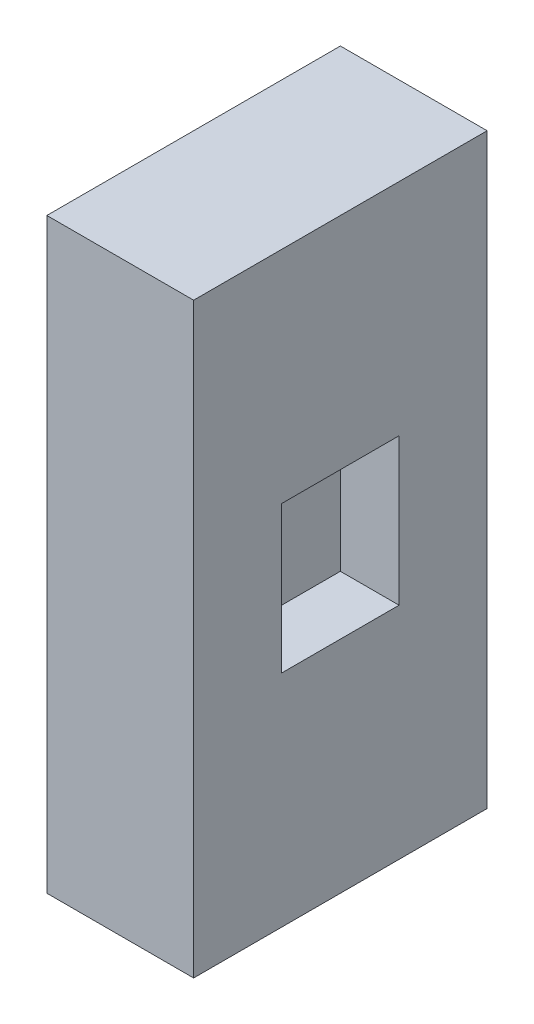
ISO-10303-21;
HEADER;
FILE_DESCRIPTION(('STEP AP214'),'2;1');
FILE_NAME('part.step','',(''),(''),'','','');
FILE_SCHEMA(('AUTOMOTIVE_DESIGN { 1 0 10303 214 1 1 1 1 }'));
ENDSEC;
DATA;
#1=APPLICATION_CONTEXT('core data for automotive mechanical design processes');
#2=APPLICATION_PROTOCOL_DEFINITION('international standard','automotive_design',2000,#1);
#3=PRODUCT_CONTEXT('',#1,'mechanical');
#4=PRODUCT('Part','Part','',(#3));
#5=PRODUCT_RELATED_PRODUCT_CATEGORY('part','',(#4));
#6=PRODUCT_DEFINITION_FORMATION('','',#4);
#7=PRODUCT_DEFINITION_CONTEXT('part definition',#1,'design');
#8=PRODUCT_DEFINITION('design','',#6,#7);
#9=PRODUCT_DEFINITION_SHAPE('','',#8);
#10=(LENGTH_UNIT() NAMED_UNIT(*) SI_UNIT(.MILLI.,.METRE.));
#11=(NAMED_UNIT(*) PLANE_ANGLE_UNIT() SI_UNIT($,.RADIAN.));
#12=(NAMED_UNIT(*) SI_UNIT($,.STERADIAN.) SOLID_ANGLE_UNIT());
#13=UNCERTAINTY_MEASURE_WITH_UNIT(LENGTH_MEASURE(1.E-05),#10,'distance_accuracy_value','');
#14=(GEOMETRIC_REPRESENTATION_CONTEXT(3) GLOBAL_UNCERTAINTY_ASSIGNED_CONTEXT((#13)) GLOBAL_UNIT_ASSIGNED_CONTEXT((#10,
#11,#12)) REPRESENTATION_CONTEXT('',''));
#15=CARTESIAN_POINT('',(0.,0.,0.));
#16=DIRECTION('',(0.,0.,1.));
#17=DIRECTION('',(1.,0.,0.));
#18=AXIS2_PLACEMENT_3D('',#15,#16,#17);
#19=CARTESIAN_POINT('',(10.,0.,0.));
#20=DIRECTION('',(0.,0.,1.));
#21=DIRECTION('',(1.,0.,0.));
#22=AXIS2_PLACEMENT_3D('',#19,#20,#21);
#23=PLANE('',#22);
#24=DIRECTION('',(0.,1.,0.));
#25=VECTOR('',#24,1.);
#26=CARTESIAN_POINT('',(0.,0.,0.));
#27=LINE('',#26,#25);
#28=CARTESIAN_POINT('',(0.,0.,0.));
#29=VERTEX_POINT('',#28);
#30=CARTESIAN_POINT('',(0.,40.,0.));
#31=VERTEX_POINT('',#30);
#32=EDGE_CURVE('E153',#29,#31,#27,.T.);
#33=ORIENTED_EDGE('',*,*,#32,.T.);
#34=DIRECTION('',(-1.,0.,0.));
#35=VECTOR('',#34,1.);
#36=CARTESIAN_POINT('',(10.,40.,0.));
#37=LINE('',#36,#35);
#38=CARTESIAN_POINT('',(10.,40.,0.));
#39=VERTEX_POINT('',#38);
#40=EDGE_CURVE('E11',#39,#31,#37,.T.);
#41=ORIENTED_EDGE('',*,*,#40,.F.);
#42=DIRECTION('',(0.,1.,0.));
#43=VECTOR('',#42,1.);
#44=CARTESIAN_POINT('',(10.,0.,0.));
#45=LINE('',#44,#43);
#46=CARTESIAN_POINT('',(10.,0.,0.));
#47=VERTEX_POINT('',#46);
#48=EDGE_CURVE('E160',#47,#39,#45,.T.);
#49=ORIENTED_EDGE('',*,*,#48,.F.);
#50=DIRECTION('',(-1.,0.,0.));
#51=VECTOR('',#50,1.);
#52=CARTESIAN_POINT('',(10.,0.,0.));
#53=LINE('',#52,#51);
#54=EDGE_CURVE('E162',#47,#29,#53,.T.);
#55=ORIENTED_EDGE('',*,*,#54,.T.);
#56=EDGE_LOOP('',(#33,#41,#49,#55));
#57=FACE_BOUND('',#56,.T.);
#58=ADVANCED_FACE('F44',(#57),#23,.F.);
#59=CARTESIAN_POINT('',(10.,40.,0.));
#60=DIRECTION('',(0.,-1.,0.));
#61=DIRECTION('',(0.,0.,-1.));
#62=AXIS2_PLACEMENT_3D('',#59,#60,#61);
#63=PLANE('',#62);
#64=DIRECTION('',(0.,0.,1.));
#65=VECTOR('',#64,1.);
#66=CARTESIAN_POINT('',(0.,40.,0.));
#67=LINE('',#66,#65);
#68=CARTESIAN_POINT('',(0.,40.,20.));
#69=VERTEX_POINT('',#68);
#70=EDGE_CURVE('E167',#31,#69,#67,.T.);
#71=ORIENTED_EDGE('',*,*,#70,.T.);
#72=DIRECTION('',(-1.,0.,0.));
#73=VECTOR('',#72,1.);
#74=CARTESIAN_POINT('',(10.,40.,20.));
#75=LINE('',#74,#73);
#76=CARTESIAN_POINT('',(10.,40.,20.));
#77=VERTEX_POINT('',#76);
#78=EDGE_CURVE('E55',#77,#69,#75,.T.);
#79=ORIENTED_EDGE('',*,*,#78,.F.);
#80=DIRECTION('',(0.,0.,1.));
#81=VECTOR('',#80,1.);
#82=CARTESIAN_POINT('',(10.,40.,0.));
#83=LINE('',#82,#81);
#84=EDGE_CURVE('E96',#39,#77,#83,.T.);
#85=ORIENTED_EDGE('',*,*,#84,.F.);
#86=ORIENTED_EDGE('',*,*,#40,.T.);
#87=EDGE_LOOP('',(#71,#79,#85,#86));
#88=FACE_BOUND('',#87,.T.);
#89=ADVANCED_FACE('F198',(#88),#63,.F.);
#90=CARTESIAN_POINT('',(10.,0.,20.));
#91=DIRECTION('',(0.,0.,-1.));
#92=DIRECTION('',(-1.,0.,0.));
#93=AXIS2_PLACEMENT_3D('',#90,#91,#92);
#94=PLANE('',#93);
#95=DIRECTION('',(0.,-1.,0.));
#96=VECTOR('',#95,1.);
#97=CARTESIAN_POINT('',(0.,0.,20.));
#98=LINE('',#97,#96);
#99=CARTESIAN_POINT('',(0.,0.,20.));
#100=VERTEX_POINT('',#99);
#101=EDGE_CURVE('E169',#69,#100,#98,.T.);
#102=ORIENTED_EDGE('',*,*,#101,.T.);
#103=DIRECTION('',(-1.,0.,0.));
#104=VECTOR('',#103,1.);
#105=CARTESIAN_POINT('',(10.,0.,20.));
#106=LINE('',#105,#104);
#107=CARTESIAN_POINT('',(10.,0.,20.));
#108=VERTEX_POINT('',#107);
#109=EDGE_CURVE('E175',#108,#100,#106,.T.);
#110=ORIENTED_EDGE('',*,*,#109,.F.);
#111=DIRECTION('',(0.,-1.,0.));
#112=VECTOR('',#111,1.);
#113=CARTESIAN_POINT('',(10.,0.,20.));
#114=LINE('',#113,#112);
#115=EDGE_CURVE('E159',#77,#108,#114,.T.);
#116=ORIENTED_EDGE('',*,*,#115,.F.);
#117=ORIENTED_EDGE('',*,*,#78,.T.);
#118=EDGE_LOOP('',(#102,#110,#116,#117));
#119=FACE_BOUND('',#118,.T.);
#120=ADVANCED_FACE('F177',(#119),#94,.F.);
#121=CARTESIAN_POINT('',(10.,0.,0.));
#122=DIRECTION('',(0.,1.,0.));
#123=DIRECTION('',(0.,0.,1.));
#124=AXIS2_PLACEMENT_3D('',#121,#122,#123);
#125=PLANE('',#124);
#126=DIRECTION('',(0.,0.,-1.));
#127=VECTOR('',#126,1.);
#128=CARTESIAN_POINT('',(0.,0.,0.));
#129=LINE('',#128,#127);
#130=EDGE_CURVE('E90',#100,#29,#129,.T.);
#131=ORIENTED_EDGE('',*,*,#130,.T.);
#132=ORIENTED_EDGE('',*,*,#54,.F.);
#133=DIRECTION('',(0.,0.,-1.));
#134=VECTOR('',#133,1.);
#135=CARTESIAN_POINT('',(10.,0.,0.));
#136=LINE('',#135,#134);
#137=EDGE_CURVE('E69',#108,#47,#136,.T.);
#138=ORIENTED_EDGE('',*,*,#137,.F.);
#139=ORIENTED_EDGE('',*,*,#109,.T.);
#140=EDGE_LOOP('',(#131,#132,#138,#139));
#141=FACE_BOUND('',#140,.T.);
#142=ADVANCED_FACE('F183',(#141),#125,.F.);
#143=CARTESIAN_POINT('',(10.,0.,0.));
#144=DIRECTION('',(1.,0.,0.));
#145=DIRECTION('',(0.,0.,-1.));
#146=AXIS2_PLACEMENT_3D('',#143,#144,#145);
#147=PLANE('',#146);
#148=DIRECTION('',(0.,1.,0.));
#149=VECTOR('',#148,1.);
#150=CARTESIAN_POINT('',(10.,15.,6.));
#151=LINE('',#150,#149);
#152=CARTESIAN_POINT('',(10.,15.,6.));
#153=VERTEX_POINT('',#152);
#154=CARTESIAN_POINT('',(10.,25.,6.));
#155=VERTEX_POINT('',#154);
#156=EDGE_CURVE('E56',#153,#155,#151,.T.);
#157=ORIENTED_EDGE('',*,*,#156,.F.);
#158=DIRECTION('',(0.,0.,-1.));
#159=VECTOR('',#158,1.);
#160=CARTESIAN_POINT('',(10.,15.,6.));
#161=LINE('',#160,#159);
#162=CARTESIAN_POINT('',(10.,15.,14.));
#163=VERTEX_POINT('',#162);
#164=EDGE_CURVE('E139',#163,#153,#161,.T.);
#165=ORIENTED_EDGE('',*,*,#164,.F.);
#166=DIRECTION('',(0.,-1.,0.));
#167=VECTOR('',#166,1.);
#168=CARTESIAN_POINT('',(10.,15.,14.));
#169=LINE('',#168,#167);
#170=CARTESIAN_POINT('',(10.,25.,14.));
#171=VERTEX_POINT('',#170);
#172=EDGE_CURVE('E143',#171,#163,#169,.T.);
#173=ORIENTED_EDGE('',*,*,#172,.F.);
#174=DIRECTION('',(0.,0.,1.));
#175=VECTOR('',#174,1.);
#176=CARTESIAN_POINT('',(10.,25.,6.));
#177=LINE('',#176,#175);
#178=EDGE_CURVE('E150',#155,#171,#177,.T.);
#179=ORIENTED_EDGE('',*,*,#178,.F.);
#180=EDGE_LOOP('',(#157,#165,#173,#179));
#181=FACE_BOUND('',#180,.T.);
#182=ORIENTED_EDGE('',*,*,#48,.T.);
#183=ORIENTED_EDGE('',*,*,#84,.T.);
#184=ORIENTED_EDGE('',*,*,#115,.T.);
#185=ORIENTED_EDGE('',*,*,#137,.T.);
#186=EDGE_LOOP('',(#182,#183,#184,#185));
#187=FACE_BOUND('',#186,.T.);
#188=ADVANCED_FACE('F190',(#181,#187),#147,.T.);
#189=CARTESIAN_POINT('',(0.,0.,0.));
#190=DIRECTION('',(1.,0.,0.));
#191=DIRECTION('',(0.,0.,-1.));
#192=AXIS2_PLACEMENT_3D('',#189,#190,#191);
#193=PLANE('',#192);
#194=ORIENTED_EDGE('',*,*,#32,.F.);
#195=ORIENTED_EDGE('',*,*,#130,.F.);
#196=ORIENTED_EDGE('',*,*,#101,.F.);
#197=ORIENTED_EDGE('',*,*,#70,.F.);
#198=EDGE_LOOP('',(#194,#195,#196,#197));
#199=FACE_BOUND('',#198,.T.);
#200=ADVANCED_FACE('F182',(#199),#193,.F.);
#201=CARTESIAN_POINT('',(6.,15.,6.));
#202=DIRECTION('',(0.,0.,-1.));
#203=DIRECTION('',(-1.,0.,0.));
#204=AXIS2_PLACEMENT_3D('',#201,#202,#203);
#205=PLANE('',#204);
#206=ORIENTED_EDGE('',*,*,#156,.T.);
#207=DIRECTION('',(1.,0.,0.));
#208=VECTOR('',#207,1.);
#209=CARTESIAN_POINT('',(6.,25.,6.));
#210=LINE('',#209,#208);
#211=CARTESIAN_POINT('',(6.,25.,6.));
#212=VERTEX_POINT('',#211);
#213=EDGE_CURVE('E117',#212,#155,#210,.T.);
#214=ORIENTED_EDGE('',*,*,#213,.F.);
#215=DIRECTION('',(0.,1.,0.));
#216=VECTOR('',#215,1.);
#217=CARTESIAN_POINT('',(6.,15.,6.));
#218=LINE('',#217,#216);
#219=CARTESIAN_POINT('',(6.,15.,6.));
#220=VERTEX_POINT('',#219);
#221=EDGE_CURVE('E118',#220,#212,#218,.T.);
#222=ORIENTED_EDGE('',*,*,#221,.F.);
#223=DIRECTION('',(1.,0.,0.));
#224=VECTOR('',#223,1.);
#225=CARTESIAN_POINT('',(6.,15.,6.));
#226=LINE('',#225,#224);
#227=EDGE_CURVE('E151',#220,#153,#226,.T.);
#228=ORIENTED_EDGE('',*,*,#227,.T.);
#229=EDGE_LOOP('',(#206,#214,#222,#228));
#230=FACE_BOUND('',#229,.T.);
#231=ADVANCED_FACE('F119',(#230),#205,.F.);
#232=CARTESIAN_POINT('',(6.,15.,6.));
#233=DIRECTION('',(0.,-1.,0.));
#234=DIRECTION('',(0.,0.,-1.));
#235=AXIS2_PLACEMENT_3D('',#232,#233,#234);
#236=PLANE('',#235);
#237=ORIENTED_EDGE('',*,*,#164,.T.);
#238=ORIENTED_EDGE('',*,*,#227,.F.);
#239=DIRECTION('',(0.,0.,-1.));
#240=VECTOR('',#239,1.);
#241=CARTESIAN_POINT('',(6.,15.,6.));
#242=LINE('',#241,#240);
#243=CARTESIAN_POINT('',(6.,15.,14.));
#244=VERTEX_POINT('',#243);
#245=EDGE_CURVE('E127',#244,#220,#242,.T.);
#246=ORIENTED_EDGE('',*,*,#245,.F.);
#247=DIRECTION('',(1.,0.,0.));
#248=VECTOR('',#247,1.);
#249=CARTESIAN_POINT('',(6.,15.,14.));
#250=LINE('',#249,#248);
#251=EDGE_CURVE('E152',#244,#163,#250,.T.);
#252=ORIENTED_EDGE('',*,*,#251,.T.);
#253=EDGE_LOOP('',(#237,#238,#246,#252));
#254=FACE_BOUND('',#253,.T.);
#255=ADVANCED_FACE('F240',(#254),#236,.F.);
#256=CARTESIAN_POINT('',(6.,15.,14.));
#257=DIRECTION('',(0.,0.,1.));
#258=DIRECTION('',(1.,0.,0.));
#259=AXIS2_PLACEMENT_3D('',#256,#257,#258);
#260=PLANE('',#259);
#261=ORIENTED_EDGE('',*,*,#172,.T.);
#262=ORIENTED_EDGE('',*,*,#251,.F.);
#263=DIRECTION('',(0.,-1.,0.));
#264=VECTOR('',#263,1.);
#265=CARTESIAN_POINT('',(6.,15.,14.));
#266=LINE('',#265,#264);
#267=CARTESIAN_POINT('',(6.,25.,14.));
#268=VERTEX_POINT('',#267);
#269=EDGE_CURVE('E131',#268,#244,#266,.T.);
#270=ORIENTED_EDGE('',*,*,#269,.F.);
#271=DIRECTION('',(1.,0.,0.));
#272=VECTOR('',#271,1.);
#273=CARTESIAN_POINT('',(6.,25.,14.));
#274=LINE('',#273,#272);
#275=EDGE_CURVE('E125',#268,#171,#274,.T.);
#276=ORIENTED_EDGE('',*,*,#275,.T.);
#277=EDGE_LOOP('',(#261,#262,#270,#276));
#278=FACE_BOUND('',#277,.T.);
#279=ADVANCED_FACE('F246',(#278),#260,.F.);
#280=CARTESIAN_POINT('',(6.,25.,6.));
#281=DIRECTION('',(0.,1.,0.));
#282=DIRECTION('',(0.,0.,1.));
#283=AXIS2_PLACEMENT_3D('',#280,#281,#282);
#284=PLANE('',#283);
#285=ORIENTED_EDGE('',*,*,#178,.T.);
#286=ORIENTED_EDGE('',*,*,#275,.F.);
#287=DIRECTION('',(0.,0.,1.));
#288=VECTOR('',#287,1.);
#289=CARTESIAN_POINT('',(6.,25.,6.));
#290=LINE('',#289,#288);
#291=EDGE_CURVE('E129',#212,#268,#290,.T.);
#292=ORIENTED_EDGE('',*,*,#291,.F.);
#293=ORIENTED_EDGE('',*,*,#213,.T.);
#294=EDGE_LOOP('',(#285,#286,#292,#293));
#295=FACE_BOUND('',#294,.T.);
#296=ADVANCED_FACE('F128',(#295),#284,.F.);
#297=CARTESIAN_POINT('',(6.,0.,0.));
#298=DIRECTION('',(1.,0.,0.));
#299=DIRECTION('',(0.,0.,-1.));
#300=AXIS2_PLACEMENT_3D('',#297,#298,#299);
#301=PLANE('',#300);
#302=ORIENTED_EDGE('',*,*,#221,.T.);
#303=ORIENTED_EDGE('',*,*,#291,.T.);
#304=ORIENTED_EDGE('',*,*,#269,.T.);
#305=ORIENTED_EDGE('',*,*,#245,.T.);
#306=EDGE_LOOP('',(#302,#303,#304,#305));
#307=FACE_BOUND('',#306,.T.);
#308=ADVANCED_FACE('F136',(#307),#301,.T.);
#309=CLOSED_SHELL('',(#58,#89,#120,#142,#188,#200,#231,#255,#279,#296,#308));
#310=MANIFOLD_SOLID_BREP('B2',#309);
#311=ADVANCED_BREP_SHAPE_REPRESENTATION('',(#18,#310),#14);
#312=SHAPE_DEFINITION_REPRESENTATION(#9,#311);
ENDSEC;
END-ISO-10303-21;
